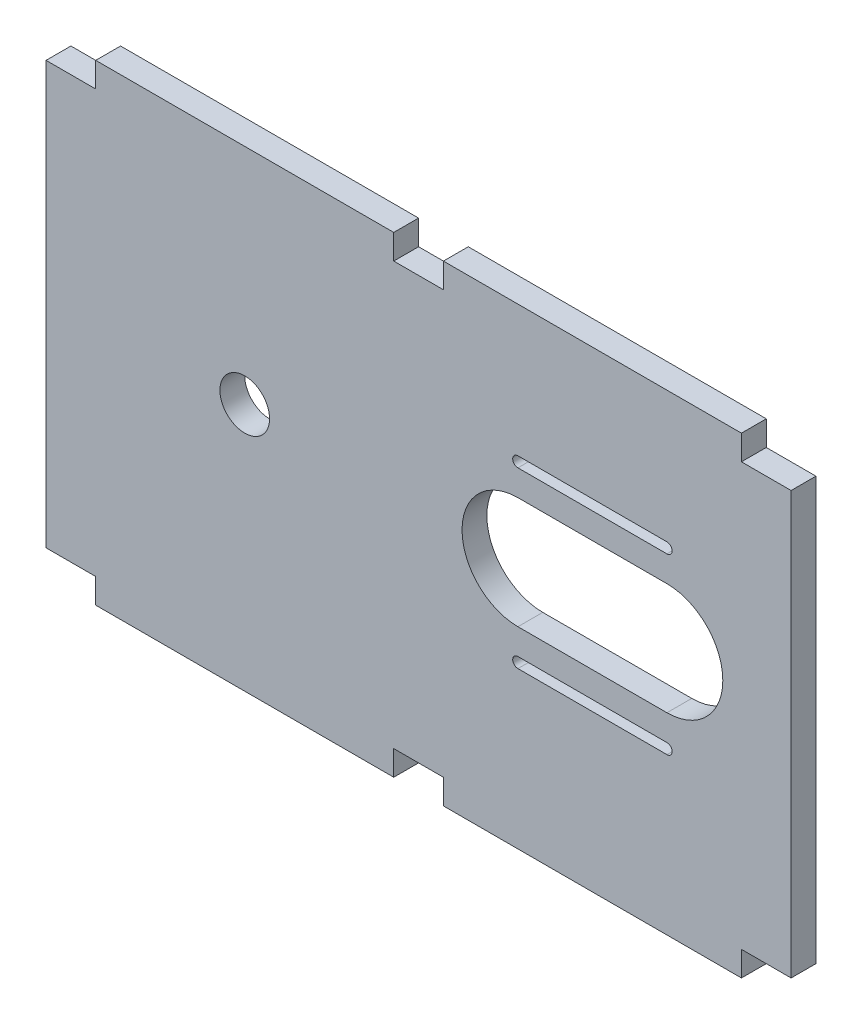
ISO-10303-21;
HEADER;
FILE_DESCRIPTION(('STEP AP214'),'2;1');
FILE_NAME('part.step','',(''),(''),'','','');
FILE_SCHEMA(('AUTOMOTIVE_DESIGN { 1 0 10303 214 1 1 1 1 }'));
ENDSEC;
DATA;
#1=APPLICATION_CONTEXT('core data for automotive mechanical design processes');
#2=APPLICATION_PROTOCOL_DEFINITION('international standard','automotive_design',2000,#1);
#3=PRODUCT_CONTEXT('',#1,'mechanical');
#4=PRODUCT('Part','Part','',(#3));
#5=PRODUCT_RELATED_PRODUCT_CATEGORY('part','',(#4));
#6=PRODUCT_DEFINITION_FORMATION('','',#4);
#7=PRODUCT_DEFINITION_CONTEXT('part definition',#1,'design');
#8=PRODUCT_DEFINITION('design','',#6,#7);
#9=PRODUCT_DEFINITION_SHAPE('','',#8);
#10=(LENGTH_UNIT() NAMED_UNIT(*) SI_UNIT(.MILLI.,.METRE.));
#11=(NAMED_UNIT(*) PLANE_ANGLE_UNIT() SI_UNIT($,.RADIAN.));
#12=(NAMED_UNIT(*) SI_UNIT($,.STERADIAN.) SOLID_ANGLE_UNIT());
#13=UNCERTAINTY_MEASURE_WITH_UNIT(LENGTH_MEASURE(1.E-05),#10,'distance_accuracy_value','');
#14=(GEOMETRIC_REPRESENTATION_CONTEXT(3) GLOBAL_UNCERTAINTY_ASSIGNED_CONTEXT((#13)) GLOBAL_UNIT_ASSIGNED_CONTEXT((#10,
#11,#12)) REPRESENTATION_CONTEXT('',''));
#15=CARTESIAN_POINT('',(0.,0.,0.));
#16=DIRECTION('',(0.,0.,1.));
#17=DIRECTION('',(1.,0.,0.));
#18=AXIS2_PLACEMENT_3D('',#15,#16,#17);
#19=CARTESIAN_POINT('',(-150.,-90.,10.));
#20=DIRECTION('',(1.,0.,0.));
#21=DIRECTION('',(0.,0.,-1.));
#22=AXIS2_PLACEMENT_3D('',#19,#20,#21);
#23=PLANE('',#22);
#24=DIRECTION('',(0.,0.,-1.));
#25=VECTOR('',#24,1.);
#26=CARTESIAN_POINT('',(-150.,-80.,0.));
#27=LINE('',#26,#25);
#28=CARTESIAN_POINT('',(-150.,-80.,10.));
#29=VERTEX_POINT('',#28);
#30=CARTESIAN_POINT('',(-150.,-80.,0.));
#31=VERTEX_POINT('',#30);
#32=EDGE_CURVE('E256',#29,#31,#27,.T.);
#33=ORIENTED_EDGE('',*,*,#32,.F.);
#34=DIRECTION('',(0.,-1.,0.));
#35=VECTOR('',#34,1.);
#36=CARTESIAN_POINT('',(-150.,-90.,10.));
#37=LINE('',#36,#35);
#38=CARTESIAN_POINT('',(-150.,90.,10.));
#39=VERTEX_POINT('',#38);
#40=EDGE_CURVE('E442',#39,#29,#37,.T.);
#41=ORIENTED_EDGE('',*,*,#40,.F.);
#42=DIRECTION('',(0.,0.,-1.));
#43=VECTOR('',#42,1.);
#44=CARTESIAN_POINT('',(-150.,90.,10.));
#45=LINE('',#44,#43);
#46=CARTESIAN_POINT('',(-150.,90.,0.));
#47=VERTEX_POINT('',#46);
#48=EDGE_CURVE('E42',#39,#47,#45,.T.);
#49=ORIENTED_EDGE('',*,*,#48,.T.);
#50=DIRECTION('',(0.,-1.,0.));
#51=VECTOR('',#50,1.);
#52=CARTESIAN_POINT('',(-150.,-90.,0.));
#53=LINE('',#52,#51);
#54=EDGE_CURVE('E393',#47,#31,#53,.T.);
#55=ORIENTED_EDGE('',*,*,#54,.T.);
#56=EDGE_LOOP('',(#33,#41,#49,#55));
#57=FACE_BOUND('',#56,.T.);
#58=ADVANCED_FACE('F32',(#57),#23,.F.);
#59=CARTESIAN_POINT('',(-150.,-90.,10.));
#60=DIRECTION('',(0.,1.,0.));
#61=DIRECTION('',(0.,0.,1.));
#62=AXIS2_PLACEMENT_3D('',#59,#60,#61);
#63=PLANE('',#62);
#64=DIRECTION('',(1.,0.,0.));
#65=VECTOR('',#64,1.);
#66=CARTESIAN_POINT('',(-150.,-90.,10.));
#67=LINE('',#66,#65);
#68=CARTESIAN_POINT('',(9.99999999999998,-90.,10.));
#69=VERTEX_POINT('',#68);
#70=CARTESIAN_POINT('',(130.,-90.,10.));
#71=VERTEX_POINT('',#70);
#72=EDGE_CURVE('E443',#69,#71,#67,.T.);
#73=ORIENTED_EDGE('',*,*,#72,.F.);
#74=DIRECTION('',(0.,0.,1.));
#75=VECTOR('',#74,1.);
#76=CARTESIAN_POINT('',(9.99999999999998,-90.,10.));
#77=LINE('',#76,#75);
#78=CARTESIAN_POINT('',(9.99999999999998,-90.,0.));
#79=VERTEX_POINT('',#78);
#80=EDGE_CURVE('E277',#79,#69,#77,.T.);
#81=ORIENTED_EDGE('',*,*,#80,.F.);
#82=DIRECTION('',(1.,0.,0.));
#83=VECTOR('',#82,1.);
#84=CARTESIAN_POINT('',(-150.,-90.,0.));
#85=LINE('',#84,#83);
#86=CARTESIAN_POINT('',(130.,-90.,0.));
#87=VERTEX_POINT('',#86);
#88=EDGE_CURVE('E403',#79,#87,#85,.T.);
#89=ORIENTED_EDGE('',*,*,#88,.T.);
#90=DIRECTION('',(0.,0.,-1.));
#91=VECTOR('',#90,1.);
#92=CARTESIAN_POINT('',(130.,-90.,0.));
#93=LINE('',#92,#91);
#94=EDGE_CURVE('E292',#71,#87,#93,.T.);
#95=ORIENTED_EDGE('',*,*,#94,.F.);
#96=EDGE_LOOP('',(#73,#81,#89,#95));
#97=FACE_BOUND('',#96,.T.);
#98=ADVANCED_FACE('F576',(#97),#63,.F.);
#99=CARTESIAN_POINT('',(-150.,90.,10.));
#100=DIRECTION('',(0.,-1.,0.));
#101=DIRECTION('',(0.,0.,-1.));
#102=AXIS2_PLACEMENT_3D('',#99,#100,#101);
#103=PLANE('',#102);
#104=DIRECTION('',(0.,0.,1.));
#105=VECTOR('',#104,1.);
#106=CARTESIAN_POINT('',(-130.,90.,0.));
#107=LINE('',#106,#105);
#108=CARTESIAN_POINT('',(-130.,90.,0.));
#109=VERTEX_POINT('',#108);
#110=CARTESIAN_POINT('',(-130.,90.,10.));
#111=VERTEX_POINT('',#110);
#112=EDGE_CURVE('E313',#109,#111,#107,.T.);
#113=ORIENTED_EDGE('',*,*,#112,.F.);
#114=DIRECTION('',(-1.,0.,0.));
#115=VECTOR('',#114,1.);
#116=CARTESIAN_POINT('',(-150.,90.,0.));
#117=LINE('',#116,#115);
#118=EDGE_CURVE('E385',#109,#47,#117,.T.);
#119=ORIENTED_EDGE('',*,*,#118,.T.);
#120=ORIENTED_EDGE('',*,*,#48,.F.);
#121=DIRECTION('',(-1.,0.,0.));
#122=VECTOR('',#121,1.);
#123=CARTESIAN_POINT('',(-150.,90.,10.));
#124=LINE('',#123,#122);
#125=EDGE_CURVE('E36',#111,#39,#124,.T.);
#126=ORIENTED_EDGE('',*,*,#125,.F.);
#127=EDGE_LOOP('',(#113,#119,#120,#126));
#128=FACE_BOUND('',#127,.T.);
#129=ADVANCED_FACE('F419',(#128),#103,.F.);
#130=DIRECTION('',(0.,0.,-1.));
#131=VECTOR('',#130,1.);
#132=CARTESIAN_POINT('',(-10.,90.,0.));
#133=LINE('',#132,#131);
#134=CARTESIAN_POINT('',(-10.,90.,10.));
#135=VERTEX_POINT('',#134);
#136=CARTESIAN_POINT('',(-10.,90.,0.));
#137=VERTEX_POINT('',#136);
#138=EDGE_CURVE('E320',#135,#137,#133,.T.);
#139=ORIENTED_EDGE('',*,*,#138,.F.);
#140=CARTESIAN_POINT('',(9.99999999999999,90.,10.));
#141=VERTEX_POINT('',#140);
#142=EDGE_CURVE('E362',#141,#135,#124,.T.);
#143=ORIENTED_EDGE('',*,*,#142,.F.);
#144=DIRECTION('',(0.,0.,1.));
#145=VECTOR('',#144,1.);
#146=CARTESIAN_POINT('',(10.,90.,0.));
#147=LINE('',#146,#145);
#148=CARTESIAN_POINT('',(10.,90.,0.));
#149=VERTEX_POINT('',#148);
#150=EDGE_CURVE('E342',#149,#141,#147,.T.);
#151=ORIENTED_EDGE('',*,*,#150,.F.);
#152=EDGE_CURVE('E387',#149,#137,#117,.T.);
#153=ORIENTED_EDGE('',*,*,#152,.T.);
#154=EDGE_LOOP('',(#139,#143,#151,#153));
#155=FACE_BOUND('',#154,.T.);
#156=ADVANCED_FACE('F435',(#155),#103,.F.);
#157=DIRECTION('',(0.,0.,-1.));
#158=VECTOR('',#157,1.);
#159=CARTESIAN_POINT('',(130.,90.,0.));
#160=LINE('',#159,#158);
#161=CARTESIAN_POINT('',(130.,90.,10.));
#162=VERTEX_POINT('',#161);
#163=CARTESIAN_POINT('',(130.,90.,0.));
#164=VERTEX_POINT('',#163);
#165=EDGE_CURVE('E347',#162,#164,#160,.T.);
#166=ORIENTED_EDGE('',*,*,#165,.F.);
#167=CARTESIAN_POINT('',(150.,90.,10.));
#168=VERTEX_POINT('',#167);
#169=EDGE_CURVE('E440',#168,#162,#124,.T.);
#170=ORIENTED_EDGE('',*,*,#169,.F.);
#171=DIRECTION('',(0.,0.,-1.));
#172=VECTOR('',#171,1.);
#173=CARTESIAN_POINT('',(150.,90.,10.));
#174=LINE('',#173,#172);
#175=CARTESIAN_POINT('',(150.,90.,0.));
#176=VERTEX_POINT('',#175);
#177=EDGE_CURVE('E11',#168,#176,#174,.T.);
#178=ORIENTED_EDGE('',*,*,#177,.T.);
#179=EDGE_CURVE('E399',#176,#164,#117,.T.);
#180=ORIENTED_EDGE('',*,*,#179,.T.);
#181=EDGE_LOOP('',(#166,#170,#178,#180));
#182=FACE_BOUND('',#181,.T.);
#183=ADVANCED_FACE('F584',(#182),#103,.F.);
#184=CARTESIAN_POINT('',(0.,0.,10.));
#185=DIRECTION('',(0.,0.,-1.));
#186=DIRECTION('',(-1.,0.,0.));
#187=AXIS2_PLACEMENT_3D('',#184,#185,#186);
#188=PLANE('',#187);
#189=CARTESIAN_POINT('',(100.,45.,10.));
#190=DIRECTION('',(0.,0.,1.));
#191=DIRECTION('',(1.,0.,0.));
#192=AXIS2_PLACEMENT_3D('',#189,#190,#191);
#193=CIRCLE('',#192,2.09999999999999);
#194=CARTESIAN_POINT('',(100.,42.9,10.));
#195=VERTEX_POINT('',#194);
#196=CARTESIAN_POINT('',(100.,47.1,10.));
#197=VERTEX_POINT('',#196);
#198=EDGE_CURVE('E500',#195,#197,#193,.T.);
#199=ORIENTED_EDGE('',*,*,#198,.F.);
#200=DIRECTION('',(1.,0.,0.));
#201=VECTOR('',#200,1.);
#202=CARTESIAN_POINT('',(100.,42.9,10.));
#203=LINE('',#202,#201);
#204=CARTESIAN_POINT('',(40.,42.9,10.));
#205=VERTEX_POINT('',#204);
#206=EDGE_CURVE('E496',#205,#195,#203,.T.);
#207=ORIENTED_EDGE('',*,*,#206,.F.);
#208=CARTESIAN_POINT('',(40.,45.,10.));
#209=DIRECTION('',(0.,0.,1.));
#210=DIRECTION('',(1.,0.,0.));
#211=AXIS2_PLACEMENT_3D('',#208,#209,#210);
#212=CIRCLE('',#211,2.09999999999999);
#213=CARTESIAN_POINT('',(40.,47.1,10.));
#214=VERTEX_POINT('',#213);
#215=EDGE_CURVE('E512',#214,#205,#212,.T.);
#216=ORIENTED_EDGE('',*,*,#215,.F.);
#217=DIRECTION('',(-1.,0.,0.));
#218=VECTOR('',#217,1.);
#219=CARTESIAN_POINT('',(100.,47.1,10.));
#220=LINE('',#219,#218);
#221=EDGE_CURVE('E515',#197,#214,#220,.T.);
#222=ORIENTED_EDGE('',*,*,#221,.F.);
#223=EDGE_LOOP('',(#199,#207,#216,#222));
#224=FACE_BOUND('',#223,.T.);
#225=CARTESIAN_POINT('',(100.,10.,10.));
#226=DIRECTION('',(0.,0.,1.));
#227=DIRECTION('',(1.,0.,0.));
#228=AXIS2_PLACEMENT_3D('',#225,#226,#227);
#229=CIRCLE('',#228,22.5);
#230=CARTESIAN_POINT('',(100.,-12.5,10.));
#231=VERTEX_POINT('',#230);
#232=CARTESIAN_POINT('',(100.,32.5,10.));
#233=VERTEX_POINT('',#232);
#234=EDGE_CURVE('E463',#231,#233,#229,.T.);
#235=ORIENTED_EDGE('',*,*,#234,.F.);
#236=DIRECTION('',(1.,0.,0.));
#237=VECTOR('',#236,1.);
#238=CARTESIAN_POINT('',(100.,-12.5,10.));
#239=LINE('',#238,#237);
#240=CARTESIAN_POINT('',(40.,-12.5,10.));
#241=VERTEX_POINT('',#240);
#242=EDGE_CURVE('E459',#241,#231,#239,.T.);
#243=ORIENTED_EDGE('',*,*,#242,.F.);
#244=CARTESIAN_POINT('',(40.,10.,10.));
#245=DIRECTION('',(0.,0.,1.));
#246=DIRECTION('',(1.,0.,0.));
#247=AXIS2_PLACEMENT_3D('',#244,#245,#246);
#248=CIRCLE('',#247,22.5);
#249=CARTESIAN_POINT('',(40.,32.5,10.));
#250=VERTEX_POINT('',#249);
#251=EDGE_CURVE('E475',#250,#241,#248,.T.);
#252=ORIENTED_EDGE('',*,*,#251,.F.);
#253=DIRECTION('',(-1.,0.,0.));
#254=VECTOR('',#253,1.);
#255=CARTESIAN_POINT('',(100.,32.5,10.));
#256=LINE('',#255,#254);
#257=EDGE_CURVE('E478',#233,#250,#256,.T.);
#258=ORIENTED_EDGE('',*,*,#257,.F.);
#259=EDGE_LOOP('',(#235,#243,#252,#258));
#260=FACE_BOUND('',#259,.T.);
#261=DIRECTION('',(-1.,0.,0.));
#262=VECTOR('',#261,1.);
#263=CARTESIAN_POINT('',(-150.,-80.,10.));
#264=LINE('',#263,#262);
#265=CARTESIAN_POINT('',(-130.,-80.,10.));
#266=VERTEX_POINT('',#265);
#267=EDGE_CURVE('E250',#266,#29,#264,.T.);
#268=ORIENTED_EDGE('',*,*,#267,.F.);
#269=DIRECTION('',(0.,-1.,0.));
#270=VECTOR('',#269,1.);
#271=CARTESIAN_POINT('',(-130.,-80.,10.));
#272=LINE('',#271,#270);
#273=CARTESIAN_POINT('',(-130.,-90.,10.));
#274=VERTEX_POINT('',#273);
#275=EDGE_CURVE('E247',#266,#274,#272,.T.);
#276=ORIENTED_EDGE('',*,*,#275,.T.);
#277=CARTESIAN_POINT('',(-10.,-90.,10.));
#278=VERTEX_POINT('',#277);
#279=EDGE_CURVE('E58',#274,#278,#67,.T.);
#280=ORIENTED_EDGE('',*,*,#279,.T.);
#281=DIRECTION('',(0.,-1.,0.));
#282=VECTOR('',#281,1.);
#283=CARTESIAN_POINT('',(-10.,-80.,10.));
#284=LINE('',#283,#282);
#285=CARTESIAN_POINT('',(-10.,-80.,10.));
#286=VERTEX_POINT('',#285);
#287=EDGE_CURVE('E285',#286,#278,#284,.T.);
#288=ORIENTED_EDGE('',*,*,#287,.F.);
#289=DIRECTION('',(-1.,0.,0.));
#290=VECTOR('',#289,1.);
#291=CARTESIAN_POINT('',(9.99999999999998,-80.,10.));
#292=LINE('',#291,#290);
#293=CARTESIAN_POINT('',(9.99999999999998,-80.,10.));
#294=VERTEX_POINT('',#293);
#295=EDGE_CURVE('E273',#294,#286,#292,.T.);
#296=ORIENTED_EDGE('',*,*,#295,.F.);
#297=DIRECTION('',(0.,-1.,0.));
#298=VECTOR('',#297,1.);
#299=CARTESIAN_POINT('',(9.99999999999998,-80.,10.));
#300=LINE('',#299,#298);
#301=EDGE_CURVE('E289',#294,#69,#300,.T.);
#302=ORIENTED_EDGE('',*,*,#301,.T.);
#303=ORIENTED_EDGE('',*,*,#72,.T.);
#304=DIRECTION('',(0.,-1.,0.));
#305=VECTOR('',#304,1.);
#306=CARTESIAN_POINT('',(130.,-80.,10.));
#307=LINE('',#306,#305);
#308=CARTESIAN_POINT('',(130.,-80.,10.));
#309=VERTEX_POINT('',#308);
#310=EDGE_CURVE('E307',#309,#71,#307,.T.);
#311=ORIENTED_EDGE('',*,*,#310,.F.);
#312=DIRECTION('',(-1.,0.,0.));
#313=VECTOR('',#312,1.);
#314=CARTESIAN_POINT('',(150.,-80.,10.));
#315=LINE('',#314,#313);
#316=CARTESIAN_POINT('',(150.,-80.,10.));
#317=VERTEX_POINT('',#316);
#318=EDGE_CURVE('E302',#317,#309,#315,.T.);
#319=ORIENTED_EDGE('',*,*,#318,.F.);
#320=DIRECTION('',(0.,1.,0.));
#321=VECTOR('',#320,1.);
#322=CARTESIAN_POINT('',(150.,-90.,10.));
#323=LINE('',#322,#321);
#324=EDGE_CURVE('E402',#317,#168,#323,.T.);
#325=ORIENTED_EDGE('',*,*,#324,.T.);
#326=ORIENTED_EDGE('',*,*,#169,.T.);
#327=DIRECTION('',(0.,-1.,0.));
#328=VECTOR('',#327,1.);
#329=CARTESIAN_POINT('',(130.,100.,10.));
#330=LINE('',#329,#328);
#331=CARTESIAN_POINT('',(130.,100.,10.));
#332=VERTEX_POINT('',#331);
#333=EDGE_CURVE('E368',#332,#162,#330,.T.);
#334=ORIENTED_EDGE('',*,*,#333,.F.);
#335=DIRECTION('',(1.,0.,0.));
#336=VECTOR('',#335,1.);
#337=CARTESIAN_POINT('',(130.,100.,10.));
#338=LINE('',#337,#336);
#339=CARTESIAN_POINT('',(9.99999999999999,100.,10.));
#340=VERTEX_POINT('',#339);
#341=EDGE_CURVE('E349',#340,#332,#338,.T.);
#342=ORIENTED_EDGE('',*,*,#341,.F.);
#343=DIRECTION('',(0.,-1.,0.));
#344=VECTOR('',#343,1.);
#345=CARTESIAN_POINT('',(9.99999999999999,100.,10.));
#346=LINE('',#345,#344);
#347=EDGE_CURVE('E364',#340,#141,#346,.T.);
#348=ORIENTED_EDGE('',*,*,#347,.T.);
#349=ORIENTED_EDGE('',*,*,#142,.T.);
#350=DIRECTION('',(0.,-1.,0.));
#351=VECTOR('',#350,1.);
#352=CARTESIAN_POINT('',(-10.,100.,10.));
#353=LINE('',#352,#351);
#354=CARTESIAN_POINT('',(-10.,100.,10.));
#355=VERTEX_POINT('',#354);
#356=EDGE_CURVE('E333',#355,#135,#353,.T.);
#357=ORIENTED_EDGE('',*,*,#356,.F.);
#358=DIRECTION('',(1.,0.,0.));
#359=VECTOR('',#358,1.);
#360=CARTESIAN_POINT('',(-10.,100.,10.));
#361=LINE('',#360,#359);
#362=CARTESIAN_POINT('',(-130.,100.,10.));
#363=VERTEX_POINT('',#362);
#364=EDGE_CURVE('E322',#363,#355,#361,.T.);
#365=ORIENTED_EDGE('',*,*,#364,.F.);
#366=DIRECTION('',(0.,-1.,0.));
#367=VECTOR('',#366,1.);
#368=CARTESIAN_POINT('',(-130.,100.,10.));
#369=LINE('',#368,#367);
#370=EDGE_CURVE('E336',#363,#111,#369,.T.);
#371=ORIENTED_EDGE('',*,*,#370,.T.);
#372=ORIENTED_EDGE('',*,*,#125,.T.);
#373=ORIENTED_EDGE('',*,*,#40,.T.);
#374=EDGE_LOOP('',(#268,#276,#280,#288,#296,#302,#303,#311,#319,#325,#326,#334,#342,#348,#349,
#357,#365,#371,#372,#373));
#375=FACE_BOUND('',#374,.T.);
#376=CARTESIAN_POINT('',(-70.,10.,10.));
#377=DIRECTION('',(0.,0.,1.));
#378=DIRECTION('',(1.,0.,0.));
#379=AXIS2_PLACEMENT_3D('',#376,#377,#378);
#380=CIRCLE('',#379,10.);
#381=CARTESIAN_POINT('',(-60.,10.,10.));
#382=VERTEX_POINT('',#381);
#383=EDGE_CURVE('E473',#382,#382,#380,.T.);
#384=ORIENTED_EDGE('',*,*,#383,.F.);
#385=EDGE_LOOP('',(#384));
#386=FACE_BOUND('',#385,.T.);
#387=CARTESIAN_POINT('',(100.,-25.,10.));
#388=DIRECTION('',(0.,0.,1.));
#389=DIRECTION('',(1.,0.,0.));
#390=AXIS2_PLACEMENT_3D('',#387,#388,#389);
#391=CIRCLE('',#390,2.1);
#392=CARTESIAN_POINT('',(100.,-27.1,10.));
#393=VERTEX_POINT('',#392);
#394=CARTESIAN_POINT('',(100.,-22.9,10.));
#395=VERTEX_POINT('',#394);
#396=EDGE_CURVE('E531',#393,#395,#391,.T.);
#397=ORIENTED_EDGE('',*,*,#396,.F.);
#398=DIRECTION('',(1.,0.,0.));
#399=VECTOR('',#398,1.);
#400=CARTESIAN_POINT('',(100.,-27.1,10.));
#401=LINE('',#400,#399);
#402=CARTESIAN_POINT('',(40.,-27.1,10.));
#403=VERTEX_POINT('',#402);
#404=EDGE_CURVE('E527',#403,#393,#401,.T.);
#405=ORIENTED_EDGE('',*,*,#404,.F.);
#406=CARTESIAN_POINT('',(40.,-25.,10.));
#407=DIRECTION('',(0.,0.,1.));
#408=DIRECTION('',(1.,0.,0.));
#409=AXIS2_PLACEMENT_3D('',#406,#407,#408);
#410=CIRCLE('',#409,2.1);
#411=CARTESIAN_POINT('',(40.,-22.9,10.));
#412=VERTEX_POINT('',#411);
#413=EDGE_CURVE('E541',#412,#403,#410,.T.);
#414=ORIENTED_EDGE('',*,*,#413,.F.);
#415=DIRECTION('',(-1.,0.,0.));
#416=VECTOR('',#415,1.);
#417=CARTESIAN_POINT('',(100.,-22.9,10.));
#418=LINE('',#417,#416);
#419=EDGE_CURVE('E544',#395,#412,#418,.T.);
#420=ORIENTED_EDGE('',*,*,#419,.F.);
#421=EDGE_LOOP('',(#397,#405,#414,#420));
#422=FACE_BOUND('',#421,.T.);
#423=ADVANCED_FACE('F436',(#224,#260,#375,#386,#422),#188,.F.);
#424=CARTESIAN_POINT('',(0.,0.,0.));
#425=DIRECTION('',(0.,0.,-1.));
#426=DIRECTION('',(-1.,0.,0.));
#427=AXIS2_PLACEMENT_3D('',#424,#425,#426);
#428=PLANE('',#427);
#429=DIRECTION('',(0.,-1.,0.));
#430=VECTOR('',#429,1.);
#431=CARTESIAN_POINT('',(-130.,-80.,0.));
#432=LINE('',#431,#430);
#433=CARTESIAN_POINT('',(-130.,-80.,0.));
#434=VERTEX_POINT('',#433);
#435=CARTESIAN_POINT('',(-130.,-90.,0.));
#436=VERTEX_POINT('',#435);
#437=EDGE_CURVE('E50',#434,#436,#432,.T.);
#438=ORIENTED_EDGE('',*,*,#437,.F.);
#439=DIRECTION('',(1.,0.,0.));
#440=VECTOR('',#439,1.);
#441=CARTESIAN_POINT('',(-150.,-80.,0.));
#442=LINE('',#441,#440);
#443=EDGE_CURVE('E251',#31,#434,#442,.T.);
#444=ORIENTED_EDGE('',*,*,#443,.F.);
#445=ORIENTED_EDGE('',*,*,#54,.F.);
#446=ORIENTED_EDGE('',*,*,#118,.F.);
#447=DIRECTION('',(0.,-1.,0.));
#448=VECTOR('',#447,1.);
#449=CARTESIAN_POINT('',(-130.,100.,0.));
#450=LINE('',#449,#448);
#451=CARTESIAN_POINT('',(-130.,100.,0.));
#452=VERTEX_POINT('',#451);
#453=EDGE_CURVE('E339',#452,#109,#450,.T.);
#454=ORIENTED_EDGE('',*,*,#453,.F.);
#455=DIRECTION('',(-1.,0.,0.));
#456=VECTOR('',#455,1.);
#457=CARTESIAN_POINT('',(-10.,100.,0.));
#458=LINE('',#457,#456);
#459=CARTESIAN_POINT('',(-10.,100.,0.));
#460=VERTEX_POINT('',#459);
#461=EDGE_CURVE('E316',#460,#452,#458,.T.);
#462=ORIENTED_EDGE('',*,*,#461,.F.);
#463=DIRECTION('',(0.,-1.,0.));
#464=VECTOR('',#463,1.);
#465=CARTESIAN_POINT('',(-10.,100.,0.));
#466=LINE('',#465,#464);
#467=EDGE_CURVE('E326',#460,#137,#466,.T.);
#468=ORIENTED_EDGE('',*,*,#467,.T.);
#469=ORIENTED_EDGE('',*,*,#152,.F.);
#470=DIRECTION('',(0.,-1.,0.));
#471=VECTOR('',#470,1.);
#472=CARTESIAN_POINT('',(10.,100.,0.));
#473=LINE('',#472,#471);
#474=CARTESIAN_POINT('',(10.,100.,0.));
#475=VERTEX_POINT('',#474);
#476=EDGE_CURVE('E367',#475,#149,#473,.T.);
#477=ORIENTED_EDGE('',*,*,#476,.F.);
#478=DIRECTION('',(-1.,0.,0.));
#479=VECTOR('',#478,1.);
#480=CARTESIAN_POINT('',(130.,100.,0.));
#481=LINE('',#480,#479);
#482=CARTESIAN_POINT('',(130.,100.,0.));
#483=VERTEX_POINT('',#482);
#484=EDGE_CURVE('E343',#483,#475,#481,.T.);
#485=ORIENTED_EDGE('',*,*,#484,.F.);
#486=DIRECTION('',(0.,-1.,0.));
#487=VECTOR('',#486,1.);
#488=CARTESIAN_POINT('',(130.,100.,0.));
#489=LINE('',#488,#487);
#490=EDGE_CURVE('E353',#483,#164,#489,.T.);
#491=ORIENTED_EDGE('',*,*,#490,.T.);
#492=ORIENTED_EDGE('',*,*,#179,.F.);
#493=DIRECTION('',(0.,1.,0.));
#494=VECTOR('',#493,1.);
#495=CARTESIAN_POINT('',(150.,-90.,0.));
#496=LINE('',#495,#494);
#497=CARTESIAN_POINT('',(150.,-80.,0.));
#498=VERTEX_POINT('',#497);
#499=EDGE_CURVE('E388',#498,#176,#496,.T.);
#500=ORIENTED_EDGE('',*,*,#499,.F.);
#501=DIRECTION('',(1.,0.,0.));
#502=VECTOR('',#501,1.);
#503=CARTESIAN_POINT('',(150.,-80.,0.));
#504=LINE('',#503,#502);
#505=CARTESIAN_POINT('',(130.,-80.,0.));
#506=VERTEX_POINT('',#505);
#507=EDGE_CURVE('E298',#506,#498,#504,.T.);
#508=ORIENTED_EDGE('',*,*,#507,.F.);
#509=DIRECTION('',(0.,-1.,0.));
#510=VECTOR('',#509,1.);
#511=CARTESIAN_POINT('',(130.,-80.,0.));
#512=LINE('',#511,#510);
#513=EDGE_CURVE('E310',#506,#87,#512,.T.);
#514=ORIENTED_EDGE('',*,*,#513,.T.);
#515=ORIENTED_EDGE('',*,*,#88,.F.);
#516=DIRECTION('',(0.,-1.,0.));
#517=VECTOR('',#516,1.);
#518=CARTESIAN_POINT('',(9.99999999999998,-80.,0.));
#519=LINE('',#518,#517);
#520=CARTESIAN_POINT('',(9.99999999999998,-80.,0.));
#521=VERTEX_POINT('',#520);
#522=EDGE_CURVE('E293',#521,#79,#519,.T.);
#523=ORIENTED_EDGE('',*,*,#522,.F.);
#524=DIRECTION('',(1.,0.,0.));
#525=VECTOR('',#524,1.);
#526=CARTESIAN_POINT('',(9.99999999999998,-80.,0.));
#527=LINE('',#526,#525);
#528=CARTESIAN_POINT('',(-10.,-80.,0.));
#529=VERTEX_POINT('',#528);
#530=EDGE_CURVE('E280',#529,#521,#527,.T.);
#531=ORIENTED_EDGE('',*,*,#530,.F.);
#532=DIRECTION('',(0.,-1.,0.));
#533=VECTOR('',#532,1.);
#534=CARTESIAN_POINT('',(-10.,-80.,0.));
#535=LINE('',#534,#533);
#536=CARTESIAN_POINT('',(-10.,-90.,0.));
#537=VERTEX_POINT('',#536);
#538=EDGE_CURVE('E295',#529,#537,#535,.T.);
#539=ORIENTED_EDGE('',*,*,#538,.T.);
#540=EDGE_CURVE('E266',#436,#537,#85,.T.);
#541=ORIENTED_EDGE('',*,*,#540,.F.);
#542=EDGE_LOOP('',(#438,#444,#445,#446,#454,#462,#468,#469,#477,#485,#491,#492,#500,#508,#514,
#515,#523,#531,#539,#541));
#543=FACE_BOUND('',#542,.T.);
#544=DIRECTION('',(1.,0.,0.));
#545=VECTOR('',#544,1.);
#546=CARTESIAN_POINT('',(100.,42.9,0.));
#547=LINE('',#546,#545);
#548=CARTESIAN_POINT('',(40.,42.9,0.));
#549=VERTEX_POINT('',#548);
#550=CARTESIAN_POINT('',(100.,42.9,0.));
#551=VERTEX_POINT('',#550);
#552=EDGE_CURVE('E497',#549,#551,#547,.T.);
#553=ORIENTED_EDGE('',*,*,#552,.T.);
#554=CARTESIAN_POINT('',(100.,45.,0.));
#555=DIRECTION('',(0.,0.,1.));
#556=DIRECTION('',(1.,0.,0.));
#557=AXIS2_PLACEMENT_3D('',#554,#555,#556);
#558=CIRCLE('',#557,2.09999999999999);
#559=CARTESIAN_POINT('',(100.,47.1,0.));
#560=VERTEX_POINT('',#559);
#561=EDGE_CURVE('E507',#551,#560,#558,.T.);
#562=ORIENTED_EDGE('',*,*,#561,.T.);
#563=DIRECTION('',(-1.,0.,0.));
#564=VECTOR('',#563,1.);
#565=CARTESIAN_POINT('',(100.,47.1,0.));
#566=LINE('',#565,#564);
#567=CARTESIAN_POINT('',(40.,47.1,0.));
#568=VERTEX_POINT('',#567);
#569=EDGE_CURVE('E504',#560,#568,#566,.T.);
#570=ORIENTED_EDGE('',*,*,#569,.T.);
#571=CARTESIAN_POINT('',(40.,45.,0.));
#572=DIRECTION('',(0.,0.,1.));
#573=DIRECTION('',(1.,0.,0.));
#574=AXIS2_PLACEMENT_3D('',#571,#572,#573);
#575=CIRCLE('',#574,2.09999999999999);
#576=EDGE_CURVE('E501',#568,#549,#575,.T.);
#577=ORIENTED_EDGE('',*,*,#576,.T.);
#578=EDGE_LOOP('',(#553,#562,#570,#577));
#579=FACE_BOUND('',#578,.T.);
#580=DIRECTION('',(1.,0.,0.));
#581=VECTOR('',#580,1.);
#582=CARTESIAN_POINT('',(100.,-12.5,0.));
#583=LINE('',#582,#581);
#584=CARTESIAN_POINT('',(40.,-12.5,0.));
#585=VERTEX_POINT('',#584);
#586=CARTESIAN_POINT('',(100.,-12.5,0.));
#587=VERTEX_POINT('',#586);
#588=EDGE_CURVE('E460',#585,#587,#583,.T.);
#589=ORIENTED_EDGE('',*,*,#588,.T.);
#590=CARTESIAN_POINT('',(100.,10.,0.));
#591=DIRECTION('',(0.,0.,1.));
#592=DIRECTION('',(1.,0.,0.));
#593=AXIS2_PLACEMENT_3D('',#590,#591,#592);
#594=CIRCLE('',#593,22.5);
#595=CARTESIAN_POINT('',(100.,32.5,0.));
#596=VERTEX_POINT('',#595);
#597=EDGE_CURVE('E470',#587,#596,#594,.T.);
#598=ORIENTED_EDGE('',*,*,#597,.T.);
#599=DIRECTION('',(-1.,0.,0.));
#600=VECTOR('',#599,1.);
#601=CARTESIAN_POINT('',(100.,32.5,0.));
#602=LINE('',#601,#600);
#603=CARTESIAN_POINT('',(40.,32.5,0.));
#604=VERTEX_POINT('',#603);
#605=EDGE_CURVE('E467',#596,#604,#602,.T.);
#606=ORIENTED_EDGE('',*,*,#605,.T.);
#607=CARTESIAN_POINT('',(40.,10.,0.));
#608=DIRECTION('',(0.,0.,1.));
#609=DIRECTION('',(1.,0.,0.));
#610=AXIS2_PLACEMENT_3D('',#607,#608,#609);
#611=CIRCLE('',#610,22.5);
#612=EDGE_CURVE('E464',#604,#585,#611,.T.);
#613=ORIENTED_EDGE('',*,*,#612,.T.);
#614=EDGE_LOOP('',(#589,#598,#606,#613));
#615=FACE_BOUND('',#614,.T.);
#616=CARTESIAN_POINT('',(-70.,10.,0.));
#617=DIRECTION('',(0.,0.,1.));
#618=DIRECTION('',(1.,0.,0.));
#619=AXIS2_PLACEMENT_3D('',#616,#617,#618);
#620=CIRCLE('',#619,10.);
#621=CARTESIAN_POINT('',(-60.,10.,0.));
#622=VERTEX_POINT('',#621);
#623=EDGE_CURVE('E481',#622,#622,#620,.T.);
#624=ORIENTED_EDGE('',*,*,#623,.T.);
#625=EDGE_LOOP('',(#624));
#626=FACE_BOUND('',#625,.T.);
#627=DIRECTION('',(1.,0.,0.));
#628=VECTOR('',#627,1.);
#629=CARTESIAN_POINT('',(100.,-27.1,0.));
#630=LINE('',#629,#628);
#631=CARTESIAN_POINT('',(40.,-27.1,0.));
#632=VERTEX_POINT('',#631);
#633=CARTESIAN_POINT('',(100.,-27.1,0.));
#634=VERTEX_POINT('',#633);
#635=EDGE_CURVE('E528',#632,#634,#630,.T.);
#636=ORIENTED_EDGE('',*,*,#635,.T.);
#637=CARTESIAN_POINT('',(100.,-25.,0.));
#638=DIRECTION('',(0.,0.,1.));
#639=DIRECTION('',(1.,0.,0.));
#640=AXIS2_PLACEMENT_3D('',#637,#638,#639);
#641=CIRCLE('',#640,2.1);
#642=CARTESIAN_POINT('',(100.,-22.9,0.));
#643=VERTEX_POINT('',#642);
#644=EDGE_CURVE('E373',#634,#643,#641,.T.);
#645=ORIENTED_EDGE('',*,*,#644,.T.);
#646=DIRECTION('',(-1.,0.,0.));
#647=VECTOR('',#646,1.);
#648=CARTESIAN_POINT('',(100.,-22.9,0.));
#649=LINE('',#648,#647);
#650=CARTESIAN_POINT('',(40.,-22.9,0.));
#651=VERTEX_POINT('',#650);
#652=EDGE_CURVE('E535',#643,#651,#649,.T.);
#653=ORIENTED_EDGE('',*,*,#652,.T.);
#654=CARTESIAN_POINT('',(40.,-25.,0.));
#655=DIRECTION('',(0.,0.,1.));
#656=DIRECTION('',(1.,0.,0.));
#657=AXIS2_PLACEMENT_3D('',#654,#655,#656);
#658=CIRCLE('',#657,2.1);
#659=EDGE_CURVE('E532',#651,#632,#658,.T.);
#660=ORIENTED_EDGE('',*,*,#659,.T.);
#661=EDGE_LOOP('',(#636,#645,#653,#660));
#662=FACE_BOUND('',#661,.T.);
#663=ADVANCED_FACE('F263',(#543,#579,#615,#626,#662),#428,.T.);
#664=CARTESIAN_POINT('',(150.,-90.,10.));
#665=DIRECTION('',(-1.,0.,0.));
#666=DIRECTION('',(0.,0.,1.));
#667=AXIS2_PLACEMENT_3D('',#664,#665,#666);
#668=PLANE('',#667);
#669=ORIENTED_EDGE('',*,*,#324,.F.);
#670=DIRECTION('',(0.,0.,1.));
#671=VECTOR('',#670,1.);
#672=CARTESIAN_POINT('',(150.,-80.,0.));
#673=LINE('',#672,#671);
#674=EDGE_CURVE('E300',#498,#317,#673,.T.);
#675=ORIENTED_EDGE('',*,*,#674,.F.);
#676=ORIENTED_EDGE('',*,*,#499,.T.);
#677=ORIENTED_EDGE('',*,*,#177,.F.);
#678=EDGE_LOOP('',(#669,#675,#676,#677));
#679=FACE_BOUND('',#678,.T.);
#680=ADVANCED_FACE('F34',(#679),#668,.F.);
#681=ORIENTED_EDGE('',*,*,#279,.F.);
#682=DIRECTION('',(0.,0.,1.));
#683=VECTOR('',#682,1.);
#684=CARTESIAN_POINT('',(-130.,-90.,0.));
#685=LINE('',#684,#683);
#686=EDGE_CURVE('E260',#436,#274,#685,.T.);
#687=ORIENTED_EDGE('',*,*,#686,.F.);
#688=ORIENTED_EDGE('',*,*,#540,.T.);
#689=DIRECTION('',(0.,0.,-1.));
#690=VECTOR('',#689,1.);
#691=CARTESIAN_POINT('',(-10.,-90.,10.));
#692=LINE('',#691,#690);
#693=EDGE_CURVE('E268',#278,#537,#692,.T.);
#694=ORIENTED_EDGE('',*,*,#693,.F.);
#695=EDGE_LOOP('',(#681,#687,#688,#694));
#696=FACE_BOUND('',#695,.T.);
#697=ADVANCED_FACE('F582',(#696),#63,.F.);
#698=CARTESIAN_POINT('',(100.,10.,10.));
#699=DIRECTION('',(0.,0.,-1.));
#700=DIRECTION('',(-1.,0.,0.));
#701=AXIS2_PLACEMENT_3D('',#698,#699,#700);
#702=CYLINDRICAL_SURFACE('',#701,22.5);
#703=ORIENTED_EDGE('',*,*,#597,.F.);
#704=DIRECTION('',(0.,0.,-1.));
#705=VECTOR('',#704,1.);
#706=CARTESIAN_POINT('',(100.,-12.5,10.));
#707=LINE('',#706,#705);
#708=EDGE_CURVE('E456',#231,#587,#707,.T.);
#709=ORIENTED_EDGE('',*,*,#708,.F.);
#710=ORIENTED_EDGE('',*,*,#234,.T.);
#711=DIRECTION('',(0.,0.,-1.));
#712=VECTOR('',#711,1.);
#713=CARTESIAN_POINT('',(100.,32.5,10.));
#714=LINE('',#713,#712);
#715=EDGE_CURVE('E449',#233,#596,#714,.T.);
#716=ORIENTED_EDGE('',*,*,#715,.T.);
#717=EDGE_LOOP('',(#703,#709,#710,#716));
#718=FACE_BOUND('',#717,.T.);
#719=ADVANCED_FACE('F700',(#718),#702,.F.);
#720=CARTESIAN_POINT('',(100.,32.5,10.));
#721=DIRECTION('',(0.,-1.,0.));
#722=DIRECTION('',(0.,0.,-1.));
#723=AXIS2_PLACEMENT_3D('',#720,#721,#722);
#724=PLANE('',#723);
#725=ORIENTED_EDGE('',*,*,#605,.F.);
#726=ORIENTED_EDGE('',*,*,#715,.F.);
#727=ORIENTED_EDGE('',*,*,#257,.T.);
#728=DIRECTION('',(0.,0.,-1.));
#729=VECTOR('',#728,1.);
#730=CARTESIAN_POINT('',(40.,32.5,10.));
#731=LINE('',#730,#729);
#732=EDGE_CURVE('E452',#250,#604,#731,.T.);
#733=ORIENTED_EDGE('',*,*,#732,.T.);
#734=EDGE_LOOP('',(#725,#726,#727,#733));
#735=FACE_BOUND('',#734,.T.);
#736=ADVANCED_FACE('F791',(#735),#724,.T.);
#737=CARTESIAN_POINT('',(40.,10.,10.));
#738=DIRECTION('',(0.,0.,-1.));
#739=DIRECTION('',(-1.,0.,0.));
#740=AXIS2_PLACEMENT_3D('',#737,#738,#739);
#741=CYLINDRICAL_SURFACE('',#740,22.5);
#742=ORIENTED_EDGE('',*,*,#612,.F.);
#743=ORIENTED_EDGE('',*,*,#732,.F.);
#744=ORIENTED_EDGE('',*,*,#251,.T.);
#745=DIRECTION('',(0.,0.,-1.));
#746=VECTOR('',#745,1.);
#747=CARTESIAN_POINT('',(40.,-12.5,10.));
#748=LINE('',#747,#746);
#749=EDGE_CURVE('E454',#241,#585,#748,.T.);
#750=ORIENTED_EDGE('',*,*,#749,.T.);
#751=EDGE_LOOP('',(#742,#743,#744,#750));
#752=FACE_BOUND('',#751,.T.);
#753=ADVANCED_FACE('F798',(#752),#741,.F.);
#754=CARTESIAN_POINT('',(100.,-12.5,10.));
#755=DIRECTION('',(0.,1.,0.));
#756=DIRECTION('',(0.,0.,1.));
#757=AXIS2_PLACEMENT_3D('',#754,#755,#756);
#758=PLANE('',#757);
#759=ORIENTED_EDGE('',*,*,#588,.F.);
#760=ORIENTED_EDGE('',*,*,#749,.F.);
#761=ORIENTED_EDGE('',*,*,#242,.T.);
#762=ORIENTED_EDGE('',*,*,#708,.T.);
#763=EDGE_LOOP('',(#759,#760,#761,#762));
#764=FACE_BOUND('',#763,.T.);
#765=ADVANCED_FACE('F806',(#764),#758,.T.);
#766=CARTESIAN_POINT('',(-70.,10.,10.));
#767=DIRECTION('',(0.,0.,-1.));
#768=DIRECTION('',(-1.,0.,0.));
#769=AXIS2_PLACEMENT_3D('',#766,#767,#768);
#770=CYLINDRICAL_SURFACE('',#769,10.);
#771=ORIENTED_EDGE('',*,*,#383,.T.);
#772=EDGE_LOOP('',(#771));
#773=FACE_BOUND('',#772,.T.);
#774=ORIENTED_EDGE('',*,*,#623,.F.);
#775=EDGE_LOOP('',(#774));
#776=FACE_BOUND('',#775,.T.);
#777=ADVANCED_FACE('F814',(#773,#776),#770,.F.);
#778=CARTESIAN_POINT('',(100.,45.,10.));
#779=DIRECTION('',(0.,0.,-1.));
#780=DIRECTION('',(-1.,0.,0.));
#781=AXIS2_PLACEMENT_3D('',#778,#779,#780);
#782=CYLINDRICAL_SURFACE('',#781,2.09999999999999);
#783=ORIENTED_EDGE('',*,*,#561,.F.);
#784=DIRECTION('',(0.,0.,-1.));
#785=VECTOR('',#784,1.);
#786=CARTESIAN_POINT('',(100.,42.9,10.));
#787=LINE('',#786,#785);
#788=EDGE_CURVE('E493',#195,#551,#787,.T.);
#789=ORIENTED_EDGE('',*,*,#788,.F.);
#790=ORIENTED_EDGE('',*,*,#198,.T.);
#791=DIRECTION('',(0.,0.,-1.));
#792=VECTOR('',#791,1.);
#793=CARTESIAN_POINT('',(100.,47.1,10.));
#794=LINE('',#793,#792);
#795=EDGE_CURVE('E484',#197,#560,#794,.T.);
#796=ORIENTED_EDGE('',*,*,#795,.T.);
#797=EDGE_LOOP('',(#783,#789,#790,#796));
#798=FACE_BOUND('',#797,.T.);
#799=ADVANCED_FACE('F822',(#798),#782,.F.);
#800=CARTESIAN_POINT('',(100.,47.1,10.));
#801=DIRECTION('',(0.,-1.,0.));
#802=DIRECTION('',(0.,0.,-1.));
#803=AXIS2_PLACEMENT_3D('',#800,#801,#802);
#804=PLANE('',#803);
#805=ORIENTED_EDGE('',*,*,#569,.F.);
#806=ORIENTED_EDGE('',*,*,#795,.F.);
#807=ORIENTED_EDGE('',*,*,#221,.T.);
#808=DIRECTION('',(0.,0.,-1.));
#809=VECTOR('',#808,1.);
#810=CARTESIAN_POINT('',(40.,47.1,10.));
#811=LINE('',#810,#809);
#812=EDGE_CURVE('E489',#214,#568,#811,.T.);
#813=ORIENTED_EDGE('',*,*,#812,.T.);
#814=EDGE_LOOP('',(#805,#806,#807,#813));
#815=FACE_BOUND('',#814,.T.);
#816=ADVANCED_FACE('F830',(#815),#804,.T.);
#817=CARTESIAN_POINT('',(40.,45.,10.));
#818=DIRECTION('',(0.,0.,-1.));
#819=DIRECTION('',(-1.,0.,0.));
#820=AXIS2_PLACEMENT_3D('',#817,#818,#819);
#821=CYLINDRICAL_SURFACE('',#820,2.09999999999999);
#822=ORIENTED_EDGE('',*,*,#576,.F.);
#823=ORIENTED_EDGE('',*,*,#812,.F.);
#824=ORIENTED_EDGE('',*,*,#215,.T.);
#825=DIRECTION('',(0.,0.,-1.));
#826=VECTOR('',#825,1.);
#827=CARTESIAN_POINT('',(40.,42.9,10.));
#828=LINE('',#827,#826);
#829=EDGE_CURVE('E491',#205,#549,#828,.T.);
#830=ORIENTED_EDGE('',*,*,#829,.T.);
#831=EDGE_LOOP('',(#822,#823,#824,#830));
#832=FACE_BOUND('',#831,.T.);
#833=ADVANCED_FACE('F838',(#832),#821,.F.);
#834=CARTESIAN_POINT('',(100.,42.9,10.));
#835=DIRECTION('',(0.,1.,0.));
#836=DIRECTION('',(0.,0.,1.));
#837=AXIS2_PLACEMENT_3D('',#834,#835,#836);
#838=PLANE('',#837);
#839=ORIENTED_EDGE('',*,*,#552,.F.);
#840=ORIENTED_EDGE('',*,*,#829,.F.);
#841=ORIENTED_EDGE('',*,*,#206,.T.);
#842=ORIENTED_EDGE('',*,*,#788,.T.);
#843=EDGE_LOOP('',(#839,#840,#841,#842));
#844=FACE_BOUND('',#843,.T.);
#845=ADVANCED_FACE('F846',(#844),#838,.T.);
#846=CARTESIAN_POINT('',(100.,-25.,10.));
#847=DIRECTION('',(0.,0.,-1.));
#848=DIRECTION('',(-1.,0.,0.));
#849=AXIS2_PLACEMENT_3D('',#846,#847,#848);
#850=CYLINDRICAL_SURFACE('',#849,2.1);
#851=ORIENTED_EDGE('',*,*,#644,.F.);
#852=DIRECTION('',(0.,0.,-1.));
#853=VECTOR('',#852,1.);
#854=CARTESIAN_POINT('',(100.,-27.1,10.));
#855=LINE('',#854,#853);
#856=EDGE_CURVE('E524',#393,#634,#855,.T.);
#857=ORIENTED_EDGE('',*,*,#856,.F.);
#858=ORIENTED_EDGE('',*,*,#396,.T.);
#859=DIRECTION('',(0.,0.,-1.));
#860=VECTOR('',#859,1.);
#861=CARTESIAN_POINT('',(100.,-22.9,10.));
#862=LINE('',#861,#860);
#863=EDGE_CURVE('E510',#395,#643,#862,.T.);
#864=ORIENTED_EDGE('',*,*,#863,.T.);
#865=EDGE_LOOP('',(#851,#857,#858,#864));
#866=FACE_BOUND('',#865,.T.);
#867=ADVANCED_FACE('F549',(#866),#850,.F.);
#868=CARTESIAN_POINT('',(100.,-22.9,10.));
#869=DIRECTION('',(0.,-1.,0.));
#870=DIRECTION('',(0.,0.,-1.));
#871=AXIS2_PLACEMENT_3D('',#868,#869,#870);
#872=PLANE('',#871);
#873=ORIENTED_EDGE('',*,*,#652,.F.);
#874=ORIENTED_EDGE('',*,*,#863,.F.);
#875=ORIENTED_EDGE('',*,*,#419,.T.);
#876=DIRECTION('',(0.,0.,-1.));
#877=VECTOR('',#876,1.);
#878=CARTESIAN_POINT('',(40.,-22.9,10.));
#879=LINE('',#878,#877);
#880=EDGE_CURVE('E520',#412,#651,#879,.T.);
#881=ORIENTED_EDGE('',*,*,#880,.T.);
#882=EDGE_LOOP('',(#873,#874,#875,#881));
#883=FACE_BOUND('',#882,.T.);
#884=ADVANCED_FACE('F554',(#883),#872,.T.);
#885=CARTESIAN_POINT('',(40.,-25.,10.));
#886=DIRECTION('',(0.,0.,-1.));
#887=DIRECTION('',(-1.,0.,0.));
#888=AXIS2_PLACEMENT_3D('',#885,#886,#887);
#889=CYLINDRICAL_SURFACE('',#888,2.1);
#890=ORIENTED_EDGE('',*,*,#659,.F.);
#891=ORIENTED_EDGE('',*,*,#880,.F.);
#892=ORIENTED_EDGE('',*,*,#413,.T.);
#893=DIRECTION('',(0.,0.,-1.));
#894=VECTOR('',#893,1.);
#895=CARTESIAN_POINT('',(40.,-27.1,10.));
#896=LINE('',#895,#894);
#897=EDGE_CURVE('E522',#403,#632,#896,.T.);
#898=ORIENTED_EDGE('',*,*,#897,.T.);
#899=EDGE_LOOP('',(#890,#891,#892,#898));
#900=FACE_BOUND('',#899,.T.);
#901=ADVANCED_FACE('F559',(#900),#889,.F.);
#902=CARTESIAN_POINT('',(100.,-27.1,10.));
#903=DIRECTION('',(0.,1.,0.));
#904=DIRECTION('',(0.,0.,1.));
#905=AXIS2_PLACEMENT_3D('',#902,#903,#904);
#906=PLANE('',#905);
#907=ORIENTED_EDGE('',*,*,#635,.F.);
#908=ORIENTED_EDGE('',*,*,#897,.F.);
#909=ORIENTED_EDGE('',*,*,#404,.T.);
#910=ORIENTED_EDGE('',*,*,#856,.T.);
#911=EDGE_LOOP('',(#907,#908,#909,#910));
#912=FACE_BOUND('',#911,.T.);
#913=ADVANCED_FACE('F563',(#912),#906,.T.);
#914=CARTESIAN_POINT('',(10.,100.,0.));
#915=DIRECTION('',(1.,0.,0.));
#916=DIRECTION('',(0.,0.,-1.));
#917=AXIS2_PLACEMENT_3D('',#914,#915,#916);
#918=PLANE('',#917);
#919=ORIENTED_EDGE('',*,*,#150,.T.);
#920=ORIENTED_EDGE('',*,*,#347,.F.);
#921=DIRECTION('',(0.,0.,1.));
#922=VECTOR('',#921,1.);
#923=CARTESIAN_POINT('',(10.,100.,0.));
#924=LINE('',#923,#922);
#925=EDGE_CURVE('E346',#475,#340,#924,.T.);
#926=ORIENTED_EDGE('',*,*,#925,.F.);
#927=ORIENTED_EDGE('',*,*,#476,.T.);
#928=EDGE_LOOP('',(#919,#920,#926,#927));
#929=FACE_BOUND('',#928,.T.);
#930=ADVANCED_FACE('F565',(#929),#918,.F.);
#931=CARTESIAN_POINT('',(130.,100.,0.));
#932=DIRECTION('',(-1.,0.,0.));
#933=DIRECTION('',(0.,-1.,0.));
#934=AXIS2_PLACEMENT_3D('',#931,#932,#933);
#935=PLANE('',#934);
#936=ORIENTED_EDGE('',*,*,#165,.T.);
#937=ORIENTED_EDGE('',*,*,#490,.F.);
#938=DIRECTION('',(0.,0.,-1.));
#939=VECTOR('',#938,1.);
#940=CARTESIAN_POINT('',(130.,100.,0.));
#941=LINE('',#940,#939);
#942=EDGE_CURVE('E351',#332,#483,#941,.T.);
#943=ORIENTED_EDGE('',*,*,#942,.F.);
#944=ORIENTED_EDGE('',*,*,#333,.T.);
#945=EDGE_LOOP('',(#936,#937,#943,#944));
#946=FACE_BOUND('',#945,.T.);
#947=ADVANCED_FACE('F571',(#946),#935,.F.);
#948=CARTESIAN_POINT('',(0.,100.,0.));
#949=DIRECTION('',(0.,1.,0.));
#950=DIRECTION('',(-1.,0.,0.));
#951=AXIS2_PLACEMENT_3D('',#948,#949,#950);
#952=PLANE('',#951);
#953=ORIENTED_EDGE('',*,*,#484,.T.);
#954=ORIENTED_EDGE('',*,*,#925,.T.);
#955=ORIENTED_EDGE('',*,*,#341,.T.);
#956=ORIENTED_EDGE('',*,*,#942,.T.);
#957=EDGE_LOOP('',(#953,#954,#955,#956));
#958=FACE_BOUND('',#957,.T.);
#959=ADVANCED_FACE('F623',(#958),#952,.T.);
#960=CARTESIAN_POINT('',(-130.,100.,0.));
#961=DIRECTION('',(1.,0.,0.));
#962=DIRECTION('',(0.,1.,0.));
#963=AXIS2_PLACEMENT_3D('',#960,#961,#962);
#964=PLANE('',#963);
#965=ORIENTED_EDGE('',*,*,#112,.T.);
#966=ORIENTED_EDGE('',*,*,#370,.F.);
#967=DIRECTION('',(0.,0.,1.));
#968=VECTOR('',#967,1.);
#969=CARTESIAN_POINT('',(-130.,100.,0.));
#970=LINE('',#969,#968);
#971=EDGE_CURVE('E319',#452,#363,#970,.T.);
#972=ORIENTED_EDGE('',*,*,#971,.F.);
#973=ORIENTED_EDGE('',*,*,#453,.T.);
#974=EDGE_LOOP('',(#965,#966,#972,#973));
#975=FACE_BOUND('',#974,.T.);
#976=ADVANCED_FACE('F422',(#975),#964,.F.);
#977=CARTESIAN_POINT('',(-10.,100.,0.));
#978=DIRECTION('',(-1.,0.,0.));
#979=DIRECTION('',(0.,0.,1.));
#980=AXIS2_PLACEMENT_3D('',#977,#978,#979);
#981=PLANE('',#980);
#982=ORIENTED_EDGE('',*,*,#138,.T.);
#983=ORIENTED_EDGE('',*,*,#467,.F.);
#984=DIRECTION('',(0.,0.,-1.));
#985=VECTOR('',#984,1.);
#986=CARTESIAN_POINT('',(-10.,100.,0.));
#987=LINE('',#986,#985);
#988=EDGE_CURVE('E324',#355,#460,#987,.T.);
#989=ORIENTED_EDGE('',*,*,#988,.F.);
#990=ORIENTED_EDGE('',*,*,#356,.T.);
#991=EDGE_LOOP('',(#982,#983,#989,#990));
#992=FACE_BOUND('',#991,.T.);
#993=ADVANCED_FACE('F431',(#992),#981,.F.);
#994=CARTESIAN_POINT('',(0.,100.,0.));
#995=DIRECTION('',(0.,1.,0.));
#996=DIRECTION('',(-1.,0.,0.));
#997=AXIS2_PLACEMENT_3D('',#994,#995,#996);
#998=PLANE('',#997);
#999=ORIENTED_EDGE('',*,*,#461,.T.);
#1000=ORIENTED_EDGE('',*,*,#971,.T.);
#1001=ORIENTED_EDGE('',*,*,#364,.T.);
#1002=ORIENTED_EDGE('',*,*,#988,.T.);
#1003=EDGE_LOOP('',(#999,#1000,#1001,#1002));
#1004=FACE_BOUND('',#1003,.T.);
#1005=ADVANCED_FACE('F425',(#1004),#998,.T.);
#1006=CARTESIAN_POINT('',(130.,-80.,0.));
#1007=DIRECTION('',(-1.,0.,0.));
#1008=DIRECTION('',(0.,-1.,0.));
#1009=AXIS2_PLACEMENT_3D('',#1006,#1007,#1008);
#1010=PLANE('',#1009);
#1011=ORIENTED_EDGE('',*,*,#94,.T.);
#1012=ORIENTED_EDGE('',*,*,#513,.F.);
#1013=DIRECTION('',(0.,0.,-1.));
#1014=VECTOR('',#1013,1.);
#1015=CARTESIAN_POINT('',(130.,-80.,0.));
#1016=LINE('',#1015,#1014);
#1017=EDGE_CURVE('E304',#309,#506,#1016,.T.);
#1018=ORIENTED_EDGE('',*,*,#1017,.F.);
#1019=ORIENTED_EDGE('',*,*,#310,.T.);
#1020=EDGE_LOOP('',(#1011,#1012,#1018,#1019));
#1021=FACE_BOUND('',#1020,.T.);
#1022=ADVANCED_FACE('F657',(#1021),#1010,.F.);
#1023=CARTESIAN_POINT('',(0.,-80.,0.));
#1024=DIRECTION('',(0.,1.,0.));
#1025=DIRECTION('',(0.,0.,1.));
#1026=AXIS2_PLACEMENT_3D('',#1023,#1024,#1025);
#1027=PLANE('',#1026);
#1028=ORIENTED_EDGE('',*,*,#507,.T.);
#1029=ORIENTED_EDGE('',*,*,#674,.T.);
#1030=ORIENTED_EDGE('',*,*,#318,.T.);
#1031=ORIENTED_EDGE('',*,*,#1017,.T.);
#1032=EDGE_LOOP('',(#1028,#1029,#1030,#1031));
#1033=FACE_BOUND('',#1032,.T.);
#1034=ADVANCED_FACE('F708',(#1033),#1027,.F.);
#1035=CARTESIAN_POINT('',(9.99999999999998,-80.,10.));
#1036=DIRECTION('',(1.,0.,0.));
#1037=DIRECTION('',(0.,0.,-1.));
#1038=AXIS2_PLACEMENT_3D('',#1035,#1036,#1037);
#1039=PLANE('',#1038);
#1040=ORIENTED_EDGE('',*,*,#80,.T.);
#1041=ORIENTED_EDGE('',*,*,#301,.F.);
#1042=DIRECTION('',(0.,0.,1.));
#1043=VECTOR('',#1042,1.);
#1044=CARTESIAN_POINT('',(9.99999999999998,-80.,10.));
#1045=LINE('',#1044,#1043);
#1046=EDGE_CURVE('E282',#521,#294,#1045,.T.);
#1047=ORIENTED_EDGE('',*,*,#1046,.F.);
#1048=ORIENTED_EDGE('',*,*,#522,.T.);
#1049=EDGE_LOOP('',(#1040,#1041,#1047,#1048));
#1050=FACE_BOUND('',#1049,.T.);
#1051=ADVANCED_FACE('F718',(#1050),#1039,.F.);
#1052=CARTESIAN_POINT('',(-10.,-80.,10.));
#1053=DIRECTION('',(-1.,0.,0.));
#1054=DIRECTION('',(0.,0.,1.));
#1055=AXIS2_PLACEMENT_3D('',#1052,#1053,#1054);
#1056=PLANE('',#1055);
#1057=ORIENTED_EDGE('',*,*,#693,.T.);
#1058=ORIENTED_EDGE('',*,*,#538,.F.);
#1059=DIRECTION('',(0.,0.,-1.));
#1060=VECTOR('',#1059,1.);
#1061=CARTESIAN_POINT('',(-10.,-80.,10.));
#1062=LINE('',#1061,#1060);
#1063=EDGE_CURVE('E276',#286,#529,#1062,.T.);
#1064=ORIENTED_EDGE('',*,*,#1063,.F.);
#1065=ORIENTED_EDGE('',*,*,#287,.T.);
#1066=EDGE_LOOP('',(#1057,#1058,#1064,#1065));
#1067=FACE_BOUND('',#1066,.T.);
#1068=ADVANCED_FACE('F728',(#1067),#1056,.F.);
#1069=CARTESIAN_POINT('',(0.,-80.,0.));
#1070=DIRECTION('',(0.,-1.,0.));
#1071=DIRECTION('',(0.,0.,-1.));
#1072=AXIS2_PLACEMENT_3D('',#1069,#1070,#1071);
#1073=PLANE('',#1072);
#1074=ORIENTED_EDGE('',*,*,#295,.T.);
#1075=ORIENTED_EDGE('',*,*,#1063,.T.);
#1076=ORIENTED_EDGE('',*,*,#530,.T.);
#1077=ORIENTED_EDGE('',*,*,#1046,.T.);
#1078=EDGE_LOOP('',(#1074,#1075,#1076,#1077));
#1079=FACE_BOUND('',#1078,.T.);
#1080=ADVANCED_FACE('F738',(#1079),#1073,.T.);
#1081=CARTESIAN_POINT('',(-130.,-80.,0.));
#1082=DIRECTION('',(1.,0.,0.));
#1083=DIRECTION('',(0.,1.,0.));
#1084=AXIS2_PLACEMENT_3D('',#1081,#1082,#1083);
#1085=PLANE('',#1084);
#1086=ORIENTED_EDGE('',*,*,#686,.T.);
#1087=ORIENTED_EDGE('',*,*,#275,.F.);
#1088=DIRECTION('',(0.,0.,1.));
#1089=VECTOR('',#1088,1.);
#1090=CARTESIAN_POINT('',(-130.,-80.,0.));
#1091=LINE('',#1090,#1089);
#1092=EDGE_CURVE('E244',#434,#266,#1091,.T.);
#1093=ORIENTED_EDGE('',*,*,#1092,.F.);
#1094=ORIENTED_EDGE('',*,*,#437,.T.);
#1095=EDGE_LOOP('',(#1086,#1087,#1093,#1094));
#1096=FACE_BOUND('',#1095,.T.);
#1097=ADVANCED_FACE('F246',(#1096),#1085,.F.);
#1098=CARTESIAN_POINT('',(0.,-80.,0.));
#1099=DIRECTION('',(0.,-1.,0.));
#1100=DIRECTION('',(0.,0.,-1.));
#1101=AXIS2_PLACEMENT_3D('',#1098,#1099,#1100);
#1102=PLANE('',#1101);
#1103=ORIENTED_EDGE('',*,*,#443,.T.);
#1104=ORIENTED_EDGE('',*,*,#1092,.T.);
#1105=ORIENTED_EDGE('',*,*,#267,.T.);
#1106=ORIENTED_EDGE('',*,*,#32,.T.);
#1107=EDGE_LOOP('',(#1103,#1104,#1105,#1106));
#1108=FACE_BOUND('',#1107,.T.);
#1109=ADVANCED_FACE('F254',(#1108),#1102,.T.);
#1110=CLOSED_SHELL('',(#58,#98,#129,#156,#183,#423,#663,#680,#697,#719,#736,#753,#765,#777,#799,
#816,#833,#845,#867,#884,#901,#913,#930,#947,#959,#976,#993,#1005,#1022,#1034,#1051,#1068,#1080,
#1097,#1109));
#1111=MANIFOLD_SOLID_BREP('B2',#1110);
#1112=ADVANCED_BREP_SHAPE_REPRESENTATION('',(#18,#1111),#14);
#1113=SHAPE_DEFINITION_REPRESENTATION(#9,#1112);
ENDSEC;
END-ISO-10303-21;
